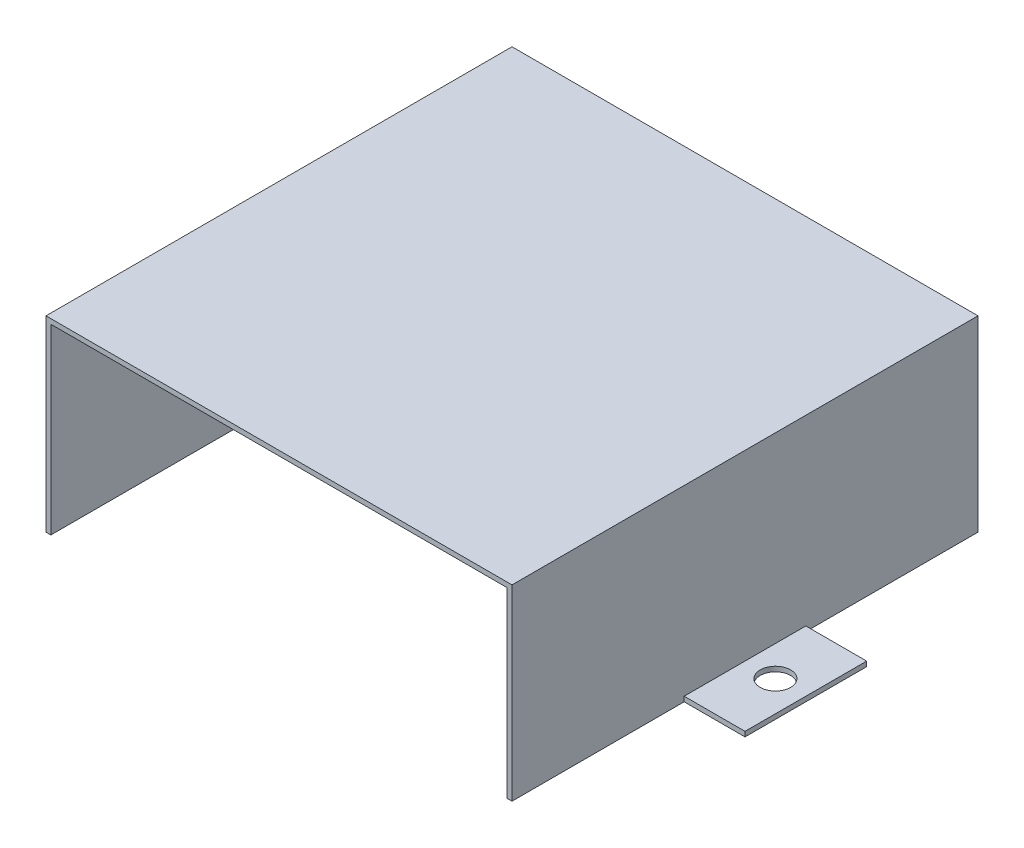
ISO-10303-21;
HEADER;
FILE_DESCRIPTION(('STEP AP214'),'2;1');
FILE_NAME('part.step','',(''),(''),'','','');
FILE_SCHEMA(('AUTOMOTIVE_DESIGN { 1 0 10303 214 1 1 1 1 }'));
ENDSEC;
DATA;
#1=APPLICATION_CONTEXT('core data for automotive mechanical design processes');
#2=APPLICATION_PROTOCOL_DEFINITION('international standard','automotive_design',2000,#1);
#3=PRODUCT_CONTEXT('',#1,'mechanical');
#4=PRODUCT('Part','Part','',(#3));
#5=PRODUCT_RELATED_PRODUCT_CATEGORY('part','',(#4));
#6=PRODUCT_DEFINITION_FORMATION('','',#4);
#7=PRODUCT_DEFINITION_CONTEXT('part definition',#1,'design');
#8=PRODUCT_DEFINITION('design','',#6,#7);
#9=PRODUCT_DEFINITION_SHAPE('','',#8);
#10=(LENGTH_UNIT() NAMED_UNIT(*) SI_UNIT(.MILLI.,.METRE.));
#11=(NAMED_UNIT(*) PLANE_ANGLE_UNIT() SI_UNIT($,.RADIAN.));
#12=(NAMED_UNIT(*) SI_UNIT($,.STERADIAN.) SOLID_ANGLE_UNIT());
#13=UNCERTAINTY_MEASURE_WITH_UNIT(LENGTH_MEASURE(1.E-05),#10,'distance_accuracy_value','');
#14=(GEOMETRIC_REPRESENTATION_CONTEXT(3) GLOBAL_UNCERTAINTY_ASSIGNED_CONTEXT((#13)) GLOBAL_UNIT_ASSIGNED_CONTEXT((#10,
#11,#12)) REPRESENTATION_CONTEXT('',''));
#15=CARTESIAN_POINT('',(0.,0.,0.));
#16=DIRECTION('',(0.,0.,1.));
#17=DIRECTION('',(1.,0.,0.));
#18=AXIS2_PLACEMENT_3D('',#15,#16,#17);
#19=CARTESIAN_POINT('',(0.,-30.,0.));
#20=DIRECTION('',(0.,1.,0.));
#21=DIRECTION('',(0.,0.,1.));
#22=AXIS2_PLACEMENT_3D('',#19,#20,#21);
#23=PLANE('',#22);
#24=CARTESIAN_POINT('',(80.8,-30.,37.5));
#25=DIRECTION('',(0.,-1.,0.));
#26=DIRECTION('',(0.,0.,-1.));
#27=AXIS2_PLACEMENT_3D('',#24,#25,#26);
#28=CIRCLE('',#27,2.5);
#29=CARTESIAN_POINT('',(80.8,-30.,35.));
#30=VERTEX_POINT('',#29);
#31=EDGE_CURVE('E175',#30,#30,#28,.T.);
#32=ORIENTED_EDGE('',*,*,#31,.F.);
#33=EDGE_LOOP('',(#32));
#34=FACE_BOUND('',#33,.T.);
#35=DIRECTION('',(1.,0.,0.));
#36=VECTOR('',#35,1.);
#37=CARTESIAN_POINT('',(-0.799999999999991,-30.,75.8));
#38=LINE('',#37,#36);
#39=CARTESIAN_POINT('',(75.,-30.,75.8));
#40=VERTEX_POINT('',#39);
#41=CARTESIAN_POINT('',(75.8,-30.,75.8));
#42=VERTEX_POINT('',#41);
#43=EDGE_CURVE('E253',#40,#42,#38,.T.);
#44=ORIENTED_EDGE('',*,*,#43,.F.);
#45=DIRECTION('',(0.,0.,-1.));
#46=VECTOR('',#45,1.);
#47=CARTESIAN_POINT('',(75.,-30.,0.));
#48=LINE('',#47,#46);
#49=CARTESIAN_POINT('',(75.,-30.,-0.8));
#50=VERTEX_POINT('',#49);
#51=EDGE_CURVE('E247',#40,#50,#48,.T.);
#52=ORIENTED_EDGE('',*,*,#51,.T.);
#53=DIRECTION('',(-1.,0.,0.));
#54=VECTOR('',#53,1.);
#55=CARTESIAN_POINT('',(-0.8,-30.,-0.8));
#56=LINE('',#55,#54);
#57=CARTESIAN_POINT('',(75.8,-30.,-0.8));
#58=VERTEX_POINT('',#57);
#59=EDGE_CURVE('E261',#58,#50,#56,.T.);
#60=ORIENTED_EDGE('',*,*,#59,.F.);
#61=DIRECTION('',(0.,0.,-1.));
#62=VECTOR('',#61,1.);
#63=CARTESIAN_POINT('',(75.8,-30.,-0.8));
#64=LINE('',#63,#62);
#65=CARTESIAN_POINT('',(75.8,-30.,27.5));
#66=VERTEX_POINT('',#65);
#67=EDGE_CURVE('E256',#66,#58,#64,.T.);
#68=ORIENTED_EDGE('',*,*,#67,.F.);
#69=DIRECTION('',(1.,0.,0.));
#70=VECTOR('',#69,1.);
#71=CARTESIAN_POINT('',(85.8,-30.,27.5));
#72=LINE('',#71,#70);
#73=CARTESIAN_POINT('',(85.8,-30.,27.5));
#74=VERTEX_POINT('',#73);
#75=EDGE_CURVE('E58',#66,#74,#72,.T.);
#76=ORIENTED_EDGE('',*,*,#75,.T.);
#77=DIRECTION('',(0.,0.,1.));
#78=VECTOR('',#77,1.);
#79=CARTESIAN_POINT('',(85.8,-30.,47.5));
#80=LINE('',#79,#78);
#81=CARTESIAN_POINT('',(85.8,-30.,47.5));
#82=VERTEX_POINT('',#81);
#83=EDGE_CURVE('E204',#74,#82,#80,.T.);
#84=ORIENTED_EDGE('',*,*,#83,.T.);
#85=DIRECTION('',(-1.,0.,0.));
#86=VECTOR('',#85,1.);
#87=CARTESIAN_POINT('',(75.8,-30.,47.5));
#88=LINE('',#87,#86);
#89=CARTESIAN_POINT('',(75.8,-30.,47.5));
#90=VERTEX_POINT('',#89);
#91=EDGE_CURVE('E193',#82,#90,#88,.T.);
#92=ORIENTED_EDGE('',*,*,#91,.T.);
#93=EDGE_CURVE('E257',#42,#90,#64,.T.);
#94=ORIENTED_EDGE('',*,*,#93,.F.);
#95=EDGE_LOOP('',(#44,#52,#60,#68,#76,#84,#92,#94));
#96=FACE_BOUND('',#95,.T.);
#97=ADVANCED_FACE('F35',(#34,#96),#23,.F.);
#98=CARTESIAN_POINT('',(0.,0.8,0.));
#99=DIRECTION('',(0.,1.,0.));
#100=DIRECTION('',(0.,0.,1.));
#101=AXIS2_PLACEMENT_3D('',#98,#99,#100);
#102=PLANE('',#101);
#103=DIRECTION('',(0.,0.,1.));
#104=VECTOR('',#103,1.);
#105=CARTESIAN_POINT('',(-0.8,0.8,-0.8));
#106=LINE('',#105,#104);
#107=CARTESIAN_POINT('',(-0.8,0.8,-0.8));
#108=VERTEX_POINT('',#107);
#109=CARTESIAN_POINT('',(-0.799999999999991,0.8,75.8));
#110=VERTEX_POINT('',#109);
#111=EDGE_CURVE('E249',#108,#110,#106,.T.);
#112=ORIENTED_EDGE('',*,*,#111,.T.);
#113=DIRECTION('',(1.,0.,0.));
#114=VECTOR('',#113,1.);
#115=CARTESIAN_POINT('',(-0.799999999999991,0.8,75.8));
#116=LINE('',#115,#114);
#117=CARTESIAN_POINT('',(75.8,0.8,75.8));
#118=VERTEX_POINT('',#117);
#119=EDGE_CURVE('E267',#110,#118,#116,.T.);
#120=ORIENTED_EDGE('',*,*,#119,.T.);
#121=DIRECTION('',(0.,0.,-1.));
#122=VECTOR('',#121,1.);
#123=CARTESIAN_POINT('',(75.8,0.8,-0.8));
#124=LINE('',#123,#122);
#125=CARTESIAN_POINT('',(75.8,0.8,-0.8));
#126=VERTEX_POINT('',#125);
#127=EDGE_CURVE('E270',#118,#126,#124,.T.);
#128=ORIENTED_EDGE('',*,*,#127,.T.);
#129=DIRECTION('',(-1.,0.,0.));
#130=VECTOR('',#129,1.);
#131=CARTESIAN_POINT('',(-0.8,0.8,-0.8));
#132=LINE('',#131,#130);
#133=EDGE_CURVE('E273',#126,#108,#132,.T.);
#134=ORIENTED_EDGE('',*,*,#133,.T.);
#135=EDGE_LOOP('',(#112,#120,#128,#134));
#136=FACE_BOUND('',#135,.T.);
#137=ADVANCED_FACE('F291',(#136),#102,.T.);
#138=CARTESIAN_POINT('',(0.,-30.,0.));
#139=DIRECTION('',(-1.,0.,0.));
#140=DIRECTION('',(0.,0.,1.));
#141=AXIS2_PLACEMENT_3D('',#138,#139,#140);
#142=PLANE('',#141);
#143=DIRECTION('',(0.,0.,1.));
#144=VECTOR('',#143,1.);
#145=CARTESIAN_POINT('',(0.,-30.,0.));
#146=LINE('',#145,#144);
#147=CARTESIAN_POINT('',(0.,-30.,-0.8));
#148=VERTEX_POINT('',#147);
#149=CARTESIAN_POINT('',(0.,-30.,75.8));
#150=VERTEX_POINT('',#149);
#151=EDGE_CURVE('E50',#148,#150,#146,.T.);
#152=ORIENTED_EDGE('',*,*,#151,.F.);
#153=DIRECTION('',(0.,1.,0.));
#154=VECTOR('',#153,1.);
#155=CARTESIAN_POINT('',(0.,0.,-0.8));
#156=LINE('',#155,#154);
#157=CARTESIAN_POINT('',(0.,0.,-0.8));
#158=VERTEX_POINT('',#157);
#159=EDGE_CURVE('E153',#148,#158,#156,.T.);
#160=ORIENTED_EDGE('',*,*,#159,.T.);
#161=DIRECTION('',(0.,0.,1.));
#162=VECTOR('',#161,1.);
#163=CARTESIAN_POINT('',(0.,0.,0.));
#164=LINE('',#163,#162);
#165=CARTESIAN_POINT('',(0.,0.,75.8));
#166=VERTEX_POINT('',#165);
#167=EDGE_CURVE('E43',#158,#166,#164,.T.);
#168=ORIENTED_EDGE('',*,*,#167,.T.);
#169=DIRECTION('',(0.,1.,0.));
#170=VECTOR('',#169,1.);
#171=CARTESIAN_POINT('',(0.,0.,75.8));
#172=LINE('',#171,#170);
#173=EDGE_CURVE('E150',#150,#166,#172,.T.);
#174=ORIENTED_EDGE('',*,*,#173,.F.);
#175=EDGE_LOOP('',(#152,#160,#168,#174));
#176=FACE_BOUND('',#175,.T.);
#177=ADVANCED_FACE('F148',(#176),#142,.F.);
#178=CARTESIAN_POINT('',(75.,-30.,0.));
#179=DIRECTION('',(1.,0.,0.));
#180=DIRECTION('',(0.,0.,-1.));
#181=AXIS2_PLACEMENT_3D('',#178,#179,#180);
#182=PLANE('',#181);
#183=ORIENTED_EDGE('',*,*,#51,.F.);
#184=DIRECTION('',(0.,-1.,0.));
#185=VECTOR('',#184,1.);
#186=CARTESIAN_POINT('',(75.,-30.,75.8));
#187=LINE('',#186,#185);
#188=CARTESIAN_POINT('',(75.,0.,75.8));
#189=VERTEX_POINT('',#188);
#190=EDGE_CURVE('E163',#189,#40,#187,.T.);
#191=ORIENTED_EDGE('',*,*,#190,.F.);
#192=DIRECTION('',(0.,0.,-1.));
#193=VECTOR('',#192,1.);
#194=CARTESIAN_POINT('',(75.,0.,0.));
#195=LINE('',#194,#193);
#196=CARTESIAN_POINT('',(75.,0.,-0.8));
#197=VERTEX_POINT('',#196);
#198=EDGE_CURVE('E11',#189,#197,#195,.T.);
#199=ORIENTED_EDGE('',*,*,#198,.T.);
#200=DIRECTION('',(0.,-1.,0.));
#201=VECTOR('',#200,1.);
#202=CARTESIAN_POINT('',(75.,-30.,-0.8));
#203=LINE('',#202,#201);
#204=EDGE_CURVE('E168',#197,#50,#203,.T.);
#205=ORIENTED_EDGE('',*,*,#204,.T.);
#206=EDGE_LOOP('',(#183,#191,#199,#205));
#207=FACE_BOUND('',#206,.T.);
#208=ADVANCED_FACE('F389',(#207),#182,.F.);
#209=CARTESIAN_POINT('',(-0.8,-30.,-0.8));
#210=DIRECTION('',(-1.,0.,0.));
#211=DIRECTION('',(0.,0.,1.));
#212=AXIS2_PLACEMENT_3D('',#209,#210,#211);
#213=PLANE('',#212);
#214=DIRECTION('',(0.,-1.,0.));
#215=VECTOR('',#214,1.);
#216=CARTESIAN_POINT('',(-0.799999999999997,-29.2,27.5));
#217=LINE('',#216,#215);
#218=CARTESIAN_POINT('',(-0.799999999999997,-29.2,27.5));
#219=VERTEX_POINT('',#218);
#220=CARTESIAN_POINT('',(-0.799999999999997,-30.,27.5));
#221=VERTEX_POINT('',#220);
#222=EDGE_CURVE('E238',#219,#221,#217,.T.);
#223=ORIENTED_EDGE('',*,*,#222,.F.);
#224=DIRECTION('',(0.,0.,1.));
#225=VECTOR('',#224,1.);
#226=CARTESIAN_POINT('',(-0.799999999999997,-29.2,27.5));
#227=LINE('',#226,#225);
#228=CARTESIAN_POINT('',(-0.8,-29.2,47.5));
#229=VERTEX_POINT('',#228);
#230=EDGE_CURVE('E217',#219,#229,#227,.T.);
#231=ORIENTED_EDGE('',*,*,#230,.T.);
#232=DIRECTION('',(0.,-1.,0.));
#233=VECTOR('',#232,1.);
#234=CARTESIAN_POINT('',(-0.8,-29.2,47.5));
#235=LINE('',#234,#233);
#236=CARTESIAN_POINT('',(-0.799999999999994,-30.,47.5));
#237=VERTEX_POINT('',#236);
#238=EDGE_CURVE('E230',#229,#237,#235,.T.);
#239=ORIENTED_EDGE('',*,*,#238,.T.);
#240=DIRECTION('',(0.,0.,1.));
#241=VECTOR('',#240,1.);
#242=CARTESIAN_POINT('',(-0.8,-30.,-0.8));
#243=LINE('',#242,#241);
#244=CARTESIAN_POINT('',(-0.799999999999991,-30.,75.8));
#245=VERTEX_POINT('',#244);
#246=EDGE_CURVE('E254',#237,#245,#243,.T.);
#247=ORIENTED_EDGE('',*,*,#246,.T.);
#248=DIRECTION('',(0.,1.,0.));
#249=VECTOR('',#248,1.);
#250=CARTESIAN_POINT('',(-0.799999999999991,-30.,75.8));
#251=LINE('',#250,#249);
#252=EDGE_CURVE('E264',#245,#110,#251,.T.);
#253=ORIENTED_EDGE('',*,*,#252,.T.);
#254=ORIENTED_EDGE('',*,*,#111,.F.);
#255=DIRECTION('',(0.,1.,0.));
#256=VECTOR('',#255,1.);
#257=CARTESIAN_POINT('',(-0.8,-30.,-0.8));
#258=LINE('',#257,#256);
#259=CARTESIAN_POINT('',(-0.8,-30.,-0.8));
#260=VERTEX_POINT('',#259);
#261=EDGE_CURVE('E157',#260,#108,#258,.T.);
#262=ORIENTED_EDGE('',*,*,#261,.F.);
#263=EDGE_CURVE('E250',#260,#221,#243,.T.);
#264=ORIENTED_EDGE('',*,*,#263,.T.);
#265=EDGE_LOOP('',(#223,#231,#239,#247,#253,#254,#262,#264));
#266=FACE_BOUND('',#265,.T.);
#267=ADVANCED_FACE('F285',(#266),#213,.T.);
#268=CARTESIAN_POINT('',(-0.8,-30.,-0.8));
#269=DIRECTION('',(0.,0.,-1.));
#270=DIRECTION('',(-1.,0.,0.));
#271=AXIS2_PLACEMENT_3D('',#268,#269,#270);
#272=PLANE('',#271);
#273=ORIENTED_EDGE('',*,*,#204,.F.);
#274=DIRECTION('',(1.,0.,0.));
#275=VECTOR('',#274,1.);
#276=CARTESIAN_POINT('',(75.,0.,-0.8));
#277=LINE('',#276,#275);
#278=EDGE_CURVE('E171',#158,#197,#277,.T.);
#279=ORIENTED_EDGE('',*,*,#278,.F.);
#280=ORIENTED_EDGE('',*,*,#159,.F.);
#281=EDGE_CURVE('E260',#148,#260,#56,.T.);
#282=ORIENTED_EDGE('',*,*,#281,.T.);
#283=ORIENTED_EDGE('',*,*,#261,.T.);
#284=ORIENTED_EDGE('',*,*,#133,.F.);
#285=DIRECTION('',(0.,1.,0.));
#286=VECTOR('',#285,1.);
#287=CARTESIAN_POINT('',(75.8,-30.,-0.8));
#288=LINE('',#287,#286);
#289=EDGE_CURVE('E277',#58,#126,#288,.T.);
#290=ORIENTED_EDGE('',*,*,#289,.F.);
#291=ORIENTED_EDGE('',*,*,#59,.T.);
#292=EDGE_LOOP('',(#273,#279,#280,#282,#283,#284,#290,#291));
#293=FACE_BOUND('',#292,.T.);
#294=ADVANCED_FACE('F296',(#293),#272,.T.);
#295=CARTESIAN_POINT('',(75.8,-30.,-0.8));
#296=DIRECTION('',(1.,0.,0.));
#297=DIRECTION('',(0.,0.,-1.));
#298=AXIS2_PLACEMENT_3D('',#295,#296,#297);
#299=PLANE('',#298);
#300=DIRECTION('',(0.,-1.,0.));
#301=VECTOR('',#300,1.);
#302=CARTESIAN_POINT('',(75.8,-29.2,47.5));
#303=LINE('',#302,#301);
#304=CARTESIAN_POINT('',(75.8,-29.2,47.5));
#305=VERTEX_POINT('',#304);
#306=EDGE_CURVE('E212',#305,#90,#303,.T.);
#307=ORIENTED_EDGE('',*,*,#306,.F.);
#308=DIRECTION('',(0.,0.,-1.));
#309=VECTOR('',#308,1.);
#310=CARTESIAN_POINT('',(75.8,-29.2,37.5));
#311=LINE('',#310,#309);
#312=CARTESIAN_POINT('',(75.8,-29.2,27.5));
#313=VERTEX_POINT('',#312);
#314=EDGE_CURVE('E199',#305,#313,#311,.T.);
#315=ORIENTED_EDGE('',*,*,#314,.T.);
#316=DIRECTION('',(0.,-1.,0.));
#317=VECTOR('',#316,1.);
#318=CARTESIAN_POINT('',(75.8,-29.2,27.5));
#319=LINE('',#318,#317);
#320=EDGE_CURVE('E209',#313,#66,#319,.T.);
#321=ORIENTED_EDGE('',*,*,#320,.T.);
#322=ORIENTED_EDGE('',*,*,#67,.T.);
#323=ORIENTED_EDGE('',*,*,#289,.T.);
#324=ORIENTED_EDGE('',*,*,#127,.F.);
#325=DIRECTION('',(0.,1.,0.));
#326=VECTOR('',#325,1.);
#327=CARTESIAN_POINT('',(75.8,-30.,75.8));
#328=LINE('',#327,#326);
#329=EDGE_CURVE('E279',#42,#118,#328,.T.);
#330=ORIENTED_EDGE('',*,*,#329,.F.);
#331=ORIENTED_EDGE('',*,*,#93,.T.);
#332=EDGE_LOOP('',(#307,#315,#321,#322,#323,#324,#330,#331));
#333=FACE_BOUND('',#332,.T.);
#334=ADVANCED_FACE('F340',(#333),#299,.T.);
#335=CARTESIAN_POINT('',(-0.799999999999991,-30.,75.8));
#336=DIRECTION('',(0.,0.,1.));
#337=DIRECTION('',(1.,0.,0.));
#338=AXIS2_PLACEMENT_3D('',#335,#336,#337);
#339=PLANE('',#338);
#340=ORIENTED_EDGE('',*,*,#190,.T.);
#341=ORIENTED_EDGE('',*,*,#43,.T.);
#342=ORIENTED_EDGE('',*,*,#329,.T.);
#343=ORIENTED_EDGE('',*,*,#119,.F.);
#344=ORIENTED_EDGE('',*,*,#252,.F.);
#345=EDGE_CURVE('E167',#245,#150,#38,.T.);
#346=ORIENTED_EDGE('',*,*,#345,.T.);
#347=ORIENTED_EDGE('',*,*,#173,.T.);
#348=DIRECTION('',(1.,0.,0.));
#349=VECTOR('',#348,1.);
#350=CARTESIAN_POINT('',(75.,0.,75.8));
#351=LINE('',#350,#349);
#352=EDGE_CURVE('E159',#166,#189,#351,.T.);
#353=ORIENTED_EDGE('',*,*,#352,.T.);
#354=EDGE_LOOP('',(#340,#341,#342,#343,#344,#346,#347,#353));
#355=FACE_BOUND('',#354,.T.);
#356=ADVANCED_FACE('F165',(#355),#339,.T.);
#357=CARTESIAN_POINT('',(-5.8,-30.,37.5));
#358=DIRECTION('',(0.,-1.,0.));
#359=DIRECTION('',(0.,0.,-1.));
#360=AXIS2_PLACEMENT_3D('',#357,#358,#359);
#361=CIRCLE('',#360,2.5);
#362=CARTESIAN_POINT('',(-5.8,-30.,35.));
#363=VERTEX_POINT('',#362);
#364=EDGE_CURVE('E183',#363,#363,#361,.T.);
#365=ORIENTED_EDGE('',*,*,#364,.F.);
#366=EDGE_LOOP('',(#365));
#367=FACE_BOUND('',#366,.T.);
#368=ORIENTED_EDGE('',*,*,#281,.F.);
#369=ORIENTED_EDGE('',*,*,#151,.T.);
#370=ORIENTED_EDGE('',*,*,#345,.F.);
#371=ORIENTED_EDGE('',*,*,#246,.F.);
#372=DIRECTION('',(-1.,0.,0.));
#373=VECTOR('',#372,1.);
#374=CARTESIAN_POINT('',(-0.8,-30.,47.5));
#375=LINE('',#374,#373);
#376=CARTESIAN_POINT('',(-10.8,-30.,47.5));
#377=VERTEX_POINT('',#376);
#378=EDGE_CURVE('E211',#237,#377,#375,.T.);
#379=ORIENTED_EDGE('',*,*,#378,.T.);
#380=DIRECTION('',(0.,0.,-1.));
#381=VECTOR('',#380,1.);
#382=CARTESIAN_POINT('',(-10.8,-30.,47.5));
#383=LINE('',#382,#381);
#384=CARTESIAN_POINT('',(-10.8,-30.,27.5));
#385=VERTEX_POINT('',#384);
#386=EDGE_CURVE('E233',#377,#385,#383,.T.);
#387=ORIENTED_EDGE('',*,*,#386,.T.);
#388=DIRECTION('',(1.,0.,0.));
#389=VECTOR('',#388,1.);
#390=CARTESIAN_POINT('',(-10.8,-30.,27.5));
#391=LINE('',#390,#389);
#392=EDGE_CURVE('E221',#385,#221,#391,.T.);
#393=ORIENTED_EDGE('',*,*,#392,.T.);
#394=ORIENTED_EDGE('',*,*,#263,.F.);
#395=EDGE_LOOP('',(#368,#369,#370,#371,#379,#387,#393,#394));
#396=FACE_BOUND('',#395,.T.);
#397=ADVANCED_FACE('F299',(#367,#396),#23,.F.);
#398=CARTESIAN_POINT('',(0.,0.,0.));
#399=DIRECTION('',(0.,1.,0.));
#400=DIRECTION('',(0.,0.,1.));
#401=AXIS2_PLACEMENT_3D('',#398,#399,#400);
#402=PLANE('',#401);
#403=ORIENTED_EDGE('',*,*,#167,.F.);
#404=ORIENTED_EDGE('',*,*,#278,.T.);
#405=ORIENTED_EDGE('',*,*,#198,.F.);
#406=ORIENTED_EDGE('',*,*,#352,.F.);
#407=EDGE_LOOP('',(#403,#404,#405,#406));
#408=FACE_BOUND('',#407,.T.);
#409=ADVANCED_FACE('F37',(#408),#402,.F.);
#410=CARTESIAN_POINT('',(-10.8,-29.2,27.5));
#411=DIRECTION('',(0.,0.,-1.));
#412=DIRECTION('',(-1.,0.,0.));
#413=AXIS2_PLACEMENT_3D('',#410,#411,#412);
#414=PLANE('',#413);
#415=ORIENTED_EDGE('',*,*,#392,.F.);
#416=DIRECTION('',(0.,-1.,0.));
#417=VECTOR('',#416,1.);
#418=CARTESIAN_POINT('',(-10.8,-29.2,27.5));
#419=LINE('',#418,#417);
#420=CARTESIAN_POINT('',(-10.8,-29.2,27.5));
#421=VERTEX_POINT('',#420);
#422=EDGE_CURVE('E240',#421,#385,#419,.T.);
#423=ORIENTED_EDGE('',*,*,#422,.F.);
#424=DIRECTION('',(1.,0.,0.));
#425=VECTOR('',#424,1.);
#426=CARTESIAN_POINT('',(-10.8,-29.2,27.5));
#427=LINE('',#426,#425);
#428=EDGE_CURVE('E227',#421,#219,#427,.T.);
#429=ORIENTED_EDGE('',*,*,#428,.T.);
#430=ORIENTED_EDGE('',*,*,#222,.T.);
#431=EDGE_LOOP('',(#415,#423,#429,#430));
#432=FACE_BOUND('',#431,.T.);
#433=ADVANCED_FACE('F303',(#432),#414,.T.);
#434=CARTESIAN_POINT('',(-10.8,-29.2,47.5));
#435=DIRECTION('',(-1.,0.,0.));
#436=DIRECTION('',(0.,0.,1.));
#437=AXIS2_PLACEMENT_3D('',#434,#435,#436);
#438=PLANE('',#437);
#439=ORIENTED_EDGE('',*,*,#386,.F.);
#440=DIRECTION('',(0.,-1.,0.));
#441=VECTOR('',#440,1.);
#442=CARTESIAN_POINT('',(-10.8,-29.2,47.5));
#443=LINE('',#442,#441);
#444=CARTESIAN_POINT('',(-10.8,-29.2,47.5));
#445=VERTEX_POINT('',#444);
#446=EDGE_CURVE('E242',#445,#377,#443,.T.);
#447=ORIENTED_EDGE('',*,*,#446,.F.);
#448=DIRECTION('',(0.,0.,-1.));
#449=VECTOR('',#448,1.);
#450=CARTESIAN_POINT('',(-10.8,-29.2,47.5));
#451=LINE('',#450,#449);
#452=EDGE_CURVE('E224',#445,#421,#451,.T.);
#453=ORIENTED_EDGE('',*,*,#452,.T.);
#454=ORIENTED_EDGE('',*,*,#422,.T.);
#455=EDGE_LOOP('',(#439,#447,#453,#454));
#456=FACE_BOUND('',#455,.T.);
#457=ADVANCED_FACE('F312',(#456),#438,.T.);
#458=CARTESIAN_POINT('',(-0.8,-29.2,47.5));
#459=DIRECTION('',(0.,0.,1.));
#460=DIRECTION('',(1.,0.,0.));
#461=AXIS2_PLACEMENT_3D('',#458,#459,#460);
#462=PLANE('',#461);
#463=ORIENTED_EDGE('',*,*,#378,.F.);
#464=ORIENTED_EDGE('',*,*,#238,.F.);
#465=DIRECTION('',(-1.,0.,0.));
#466=VECTOR('',#465,1.);
#467=CARTESIAN_POINT('',(-0.8,-29.2,47.5));
#468=LINE('',#467,#466);
#469=EDGE_CURVE('E220',#229,#445,#468,.T.);
#470=ORIENTED_EDGE('',*,*,#469,.T.);
#471=ORIENTED_EDGE('',*,*,#446,.T.);
#472=EDGE_LOOP('',(#463,#464,#470,#471));
#473=FACE_BOUND('',#472,.T.);
#474=ADVANCED_FACE('F310',(#473),#462,.T.);
#475=CARTESIAN_POINT('',(0.,-29.2,0.));
#476=DIRECTION('',(0.,-1.,0.));
#477=DIRECTION('',(0.,0.,-1.));
#478=AXIS2_PLACEMENT_3D('',#475,#476,#477);
#479=PLANE('',#478);
#480=CARTESIAN_POINT('',(-5.8,-29.2,37.5));
#481=DIRECTION('',(0.,-1.,0.));
#482=DIRECTION('',(0.,0.,-1.));
#483=AXIS2_PLACEMENT_3D('',#480,#481,#482);
#484=CIRCLE('',#483,2.5);
#485=CARTESIAN_POINT('',(-5.8,-29.2,35.));
#486=VERTEX_POINT('',#485);
#487=EDGE_CURVE('E186',#486,#486,#484,.T.);
#488=ORIENTED_EDGE('',*,*,#487,.T.);
#489=EDGE_LOOP('',(#488));
#490=FACE_BOUND('',#489,.T.);
#491=ORIENTED_EDGE('',*,*,#230,.F.);
#492=ORIENTED_EDGE('',*,*,#428,.F.);
#493=ORIENTED_EDGE('',*,*,#452,.F.);
#494=ORIENTED_EDGE('',*,*,#469,.F.);
#495=EDGE_LOOP('',(#491,#492,#493,#494));
#496=FACE_BOUND('',#495,.T.);
#497=ADVANCED_FACE('F307',(#490,#496),#479,.F.);
#498=CARTESIAN_POINT('',(85.8,-29.2,27.5));
#499=DIRECTION('',(0.,0.,-1.));
#500=DIRECTION('',(-1.,0.,0.));
#501=AXIS2_PLACEMENT_3D('',#498,#499,#500);
#502=PLANE('',#501);
#503=ORIENTED_EDGE('',*,*,#75,.F.);
#504=ORIENTED_EDGE('',*,*,#320,.F.);
#505=DIRECTION('',(1.,0.,0.));
#506=VECTOR('',#505,1.);
#507=CARTESIAN_POINT('',(85.8,-29.2,27.5));
#508=LINE('',#507,#506);
#509=CARTESIAN_POINT('',(85.8,-29.2,27.5));
#510=VERTEX_POINT('',#509);
#511=EDGE_CURVE('E189',#313,#510,#508,.T.);
#512=ORIENTED_EDGE('',*,*,#511,.T.);
#513=DIRECTION('',(0.,-1.,0.));
#514=VECTOR('',#513,1.);
#515=CARTESIAN_POINT('',(85.8,-29.2,27.5));
#516=LINE('',#515,#514);
#517=EDGE_CURVE('E202',#510,#74,#516,.T.);
#518=ORIENTED_EDGE('',*,*,#517,.T.);
#519=EDGE_LOOP('',(#503,#504,#512,#518));
#520=FACE_BOUND('',#519,.T.);
#521=ADVANCED_FACE('F353',(#520),#502,.T.);
#522=CARTESIAN_POINT('',(75.8,-29.2,47.5));
#523=DIRECTION('',(0.,0.,1.));
#524=DIRECTION('',(1.,0.,0.));
#525=AXIS2_PLACEMENT_3D('',#522,#523,#524);
#526=PLANE('',#525);
#527=ORIENTED_EDGE('',*,*,#91,.F.);
#528=DIRECTION('',(0.,-1.,0.));
#529=VECTOR('',#528,1.);
#530=CARTESIAN_POINT('',(85.8,-29.2,47.5));
#531=LINE('',#530,#529);
#532=CARTESIAN_POINT('',(85.8,-29.2,47.5));
#533=VERTEX_POINT('',#532);
#534=EDGE_CURVE('E214',#533,#82,#531,.T.);
#535=ORIENTED_EDGE('',*,*,#534,.F.);
#536=DIRECTION('',(-1.,0.,0.));
#537=VECTOR('',#536,1.);
#538=CARTESIAN_POINT('',(75.8,-29.2,47.5));
#539=LINE('',#538,#537);
#540=EDGE_CURVE('E196',#533,#305,#539,.T.);
#541=ORIENTED_EDGE('',*,*,#540,.T.);
#542=ORIENTED_EDGE('',*,*,#306,.T.);
#543=EDGE_LOOP('',(#527,#535,#541,#542));
#544=FACE_BOUND('',#543,.T.);
#545=ADVANCED_FACE('F358',(#544),#526,.T.);
#546=CARTESIAN_POINT('',(85.8,-29.2,47.5));
#547=DIRECTION('',(1.,0.,0.));
#548=DIRECTION('',(0.,0.,-1.));
#549=AXIS2_PLACEMENT_3D('',#546,#547,#548);
#550=PLANE('',#549);
#551=ORIENTED_EDGE('',*,*,#83,.F.);
#552=ORIENTED_EDGE('',*,*,#517,.F.);
#553=DIRECTION('',(0.,0.,1.));
#554=VECTOR('',#553,1.);
#555=CARTESIAN_POINT('',(85.8,-29.2,47.5));
#556=LINE('',#555,#554);
#557=EDGE_CURVE('E192',#510,#533,#556,.T.);
#558=ORIENTED_EDGE('',*,*,#557,.T.);
#559=ORIENTED_EDGE('',*,*,#534,.T.);
#560=EDGE_LOOP('',(#551,#552,#558,#559));
#561=FACE_BOUND('',#560,.T.);
#562=ADVANCED_FACE('F361',(#561),#550,.T.);
#563=CARTESIAN_POINT('',(0.,-29.2,0.));
#564=DIRECTION('',(0.,1.,0.));
#565=DIRECTION('',(0.,0.,1.));
#566=AXIS2_PLACEMENT_3D('',#563,#564,#565);
#567=PLANE('',#566);
#568=CARTESIAN_POINT('',(80.8,-29.2,37.5));
#569=DIRECTION('',(0.,1.,0.));
#570=DIRECTION('',(0.,0.,1.));
#571=AXIS2_PLACEMENT_3D('',#568,#569,#570);
#572=CIRCLE('',#571,2.5);
#573=CARTESIAN_POINT('',(80.8,-29.2,40.));
#574=VERTEX_POINT('',#573);
#575=EDGE_CURVE('E180',#574,#574,#572,.T.);
#576=ORIENTED_EDGE('',*,*,#575,.F.);
#577=EDGE_LOOP('',(#576));
#578=FACE_BOUND('',#577,.T.);
#579=ORIENTED_EDGE('',*,*,#511,.F.);
#580=ORIENTED_EDGE('',*,*,#314,.F.);
#581=ORIENTED_EDGE('',*,*,#540,.F.);
#582=ORIENTED_EDGE('',*,*,#557,.F.);
#583=EDGE_LOOP('',(#579,#580,#581,#582));
#584=FACE_BOUND('',#583,.T.);
#585=ADVANCED_FACE('F348',(#578,#584),#567,.T.);
#586=CARTESIAN_POINT('',(-5.8,-30.,37.5));
#587=DIRECTION('',(0.,-1.,0.));
#588=DIRECTION('',(0.,0.,-1.));
#589=AXIS2_PLACEMENT_3D('',#586,#587,#588);
#590=CYLINDRICAL_SURFACE('',#589,2.5);
#591=ORIENTED_EDGE('',*,*,#364,.T.);
#592=EDGE_LOOP('',(#591));
#593=FACE_BOUND('',#592,.T.);
#594=ORIENTED_EDGE('',*,*,#487,.F.);
#595=EDGE_LOOP('',(#594));
#596=FACE_BOUND('',#595,.T.);
#597=ADVANCED_FACE('F344',(#593,#596),#590,.F.);
#598=CARTESIAN_POINT('',(80.8,-30.,37.5));
#599=DIRECTION('',(0.,-1.,0.));
#600=DIRECTION('',(0.,0.,-1.));
#601=AXIS2_PLACEMENT_3D('',#598,#599,#600);
#602=CYLINDRICAL_SURFACE('',#601,2.5);
#603=ORIENTED_EDGE('',*,*,#575,.T.);
#604=EDGE_LOOP('',(#603));
#605=FACE_BOUND('',#604,.T.);
#606=ORIENTED_EDGE('',*,*,#31,.T.);
#607=EDGE_LOOP('',(#606));
#608=FACE_BOUND('',#607,.T.);
#609=ADVANCED_FACE('F347',(#605,#608),#602,.F.);
#610=CLOSED_SHELL('',(#97,#137,#177,#208,#267,#294,#334,#356,#397,#409,#433,#457,#474,#497,#521,
#545,#562,#585,#597,#609));
#611=MANIFOLD_SOLID_BREP('B2',#610);
#612=ADVANCED_BREP_SHAPE_REPRESENTATION('',(#18,#611),#14);
#613=SHAPE_DEFINITION_REPRESENTATION(#9,#612);
ENDSEC;
END-ISO-10303-21;
